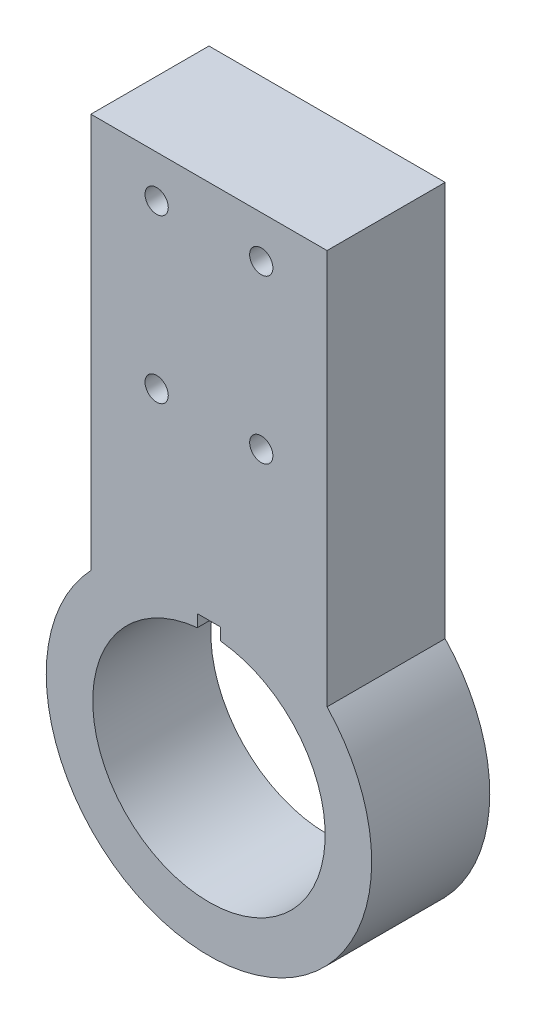
ISO-10303-21;
HEADER;
FILE_DESCRIPTION(('STEP AP214'),'2;1');
FILE_NAME('part.step','',(''),(''),'','','');
FILE_SCHEMA(('AUTOMOTIVE_DESIGN { 1 0 10303 214 1 1 1 1 }'));
ENDSEC;
DATA;
#1=APPLICATION_CONTEXT('core data for automotive mechanical design processes');
#2=APPLICATION_PROTOCOL_DEFINITION('international standard','automotive_design',2000,#1);
#3=PRODUCT_CONTEXT('',#1,'mechanical');
#4=PRODUCT('Part','Part','',(#3));
#5=PRODUCT_RELATED_PRODUCT_CATEGORY('part','',(#4));
#6=PRODUCT_DEFINITION_FORMATION('','',#4);
#7=PRODUCT_DEFINITION_CONTEXT('part definition',#1,'design');
#8=PRODUCT_DEFINITION('design','',#6,#7);
#9=PRODUCT_DEFINITION_SHAPE('','',#8);
#10=(LENGTH_UNIT() NAMED_UNIT(*) SI_UNIT(.MILLI.,.METRE.));
#11=(NAMED_UNIT(*) PLANE_ANGLE_UNIT() SI_UNIT($,.RADIAN.));
#12=(NAMED_UNIT(*) SI_UNIT($,.STERADIAN.) SOLID_ANGLE_UNIT());
#13=UNCERTAINTY_MEASURE_WITH_UNIT(LENGTH_MEASURE(1.E-05),#10,'distance_accuracy_value','');
#14=(GEOMETRIC_REPRESENTATION_CONTEXT(3) GLOBAL_UNCERTAINTY_ASSIGNED_CONTEXT((#13)) GLOBAL_UNIT_ASSIGNED_CONTEXT((#10,
#11,#12)) REPRESENTATION_CONTEXT('',''));
#15=CARTESIAN_POINT('',(0.,0.,0.));
#16=DIRECTION('',(0.,0.,1.));
#17=DIRECTION('',(1.,0.,0.));
#18=AXIS2_PLACEMENT_3D('',#15,#16,#17);
#19=CARTESIAN_POINT('',(0.,0.,25.4));
#20=DIRECTION('',(0.,0.,1.));
#21=DIRECTION('',(1.,0.,0.));
#22=AXIS2_PLACEMENT_3D('',#19,#20,#21);
#23=PLANE('',#22);
#24=CARTESIAN_POINT('',(-11.25,100.,25.4));
#25=DIRECTION('',(0.,0.,1.));
#26=DIRECTION('',(1.,0.,0.));
#27=AXIS2_PLACEMENT_3D('',#24,#25,#26);
#28=CIRCLE('',#27,2.5);
#29=CARTESIAN_POINT('',(-8.74999999999999,100.,25.4));
#30=VERTEX_POINT('',#29);
#31=EDGE_CURVE('E311',#30,#30,#28,.T.);
#32=ORIENTED_EDGE('',*,*,#31,.F.);
#33=EDGE_LOOP('',(#32));
#34=FACE_BOUND('',#33,.T.);
#35=CARTESIAN_POINT('',(11.25,65.,25.4));
#36=DIRECTION('',(0.,0.,1.));
#37=DIRECTION('',(1.,0.,0.));
#38=AXIS2_PLACEMENT_3D('',#35,#36,#37);
#39=CIRCLE('',#38,2.5);
#40=CARTESIAN_POINT('',(13.75,65.,25.4));
#41=VERTEX_POINT('',#40);
#42=EDGE_CURVE('E314',#41,#41,#39,.T.);
#43=ORIENTED_EDGE('',*,*,#42,.F.);
#44=EDGE_LOOP('',(#43));
#45=FACE_BOUND('',#44,.T.);
#46=CARTESIAN_POINT('',(-11.25,65.,25.4));
#47=DIRECTION('',(0.,0.,1.));
#48=DIRECTION('',(1.,0.,0.));
#49=AXIS2_PLACEMENT_3D('',#46,#47,#48);
#50=CIRCLE('',#49,2.5);
#51=CARTESIAN_POINT('',(-8.75000000000002,65.,25.4));
#52=VERTEX_POINT('',#51);
#53=EDGE_CURVE('E328',#52,#52,#50,.T.);
#54=ORIENTED_EDGE('',*,*,#53,.F.);
#55=EDGE_LOOP('',(#54));
#56=FACE_BOUND('',#55,.T.);
#57=CARTESIAN_POINT('',(11.25,100.,25.4));
#58=DIRECTION('',(0.,0.,1.));
#59=DIRECTION('',(1.,0.,0.));
#60=AXIS2_PLACEMENT_3D('',#57,#58,#59);
#61=CIRCLE('',#60,2.5);
#62=CARTESIAN_POINT('',(13.75,100.,25.4));
#63=VERTEX_POINT('',#62);
#64=EDGE_CURVE('E315',#63,#63,#61,.T.);
#65=ORIENTED_EDGE('',*,*,#64,.F.);
#66=EDGE_LOOP('',(#65));
#67=FACE_BOUND('',#66,.T.);
#68=DIRECTION('',(0.,-1.,0.));
#69=VECTOR('',#68,1.);
#70=CARTESIAN_POINT('',(-2.5,0.,25.4));
#71=LINE('',#70,#69);
#72=CARTESIAN_POINT('',(-2.5,27.5,25.4));
#73=VERTEX_POINT('',#72);
#74=CARTESIAN_POINT('',(-2.5,24.8746859276655,25.4));
#75=VERTEX_POINT('',#74);
#76=EDGE_CURVE('E138',#73,#75,#71,.T.);
#77=ORIENTED_EDGE('',*,*,#76,.F.);
#78=DIRECTION('',(-1.,0.,0.));
#79=VECTOR('',#78,1.);
#80=CARTESIAN_POINT('',(-2.5,27.5,25.4));
#81=LINE('',#80,#79);
#82=CARTESIAN_POINT('',(2.5,27.5,25.4));
#83=VERTEX_POINT('',#82);
#84=EDGE_CURVE('E132',#83,#73,#81,.T.);
#85=ORIENTED_EDGE('',*,*,#84,.F.);
#86=DIRECTION('',(0.,1.,0.));
#87=VECTOR('',#86,1.);
#88=CARTESIAN_POINT('',(2.5,27.5,25.4));
#89=LINE('',#88,#87);
#90=CARTESIAN_POINT('',(2.5,24.8746859276655,25.4));
#91=VERTEX_POINT('',#90);
#92=EDGE_CURVE('E114',#91,#83,#89,.T.);
#93=ORIENTED_EDGE('',*,*,#92,.F.);
#94=CARTESIAN_POINT('',(0.,0.,25.4));
#95=DIRECTION('',(0.,0.,1.));
#96=DIRECTION('',(1.,0.,0.));
#97=AXIS2_PLACEMENT_3D('',#94,#95,#96);
#98=CIRCLE('',#97,25.);
#99=EDGE_CURVE('E144',#75,#91,#98,.T.);
#100=ORIENTED_EDGE('',*,*,#99,.F.);
#101=EDGE_LOOP('',(#77,#85,#93,#100));
#102=FACE_BOUND('',#101,.T.);
#103=DIRECTION('',(0.,1.,0.));
#104=VECTOR('',#103,1.);
#105=CARTESIAN_POINT('',(25.4,24.0798671092679,25.4));
#106=LINE('',#105,#104);
#107=CARTESIAN_POINT('',(25.4,24.0798671092679,25.4));
#108=VERTEX_POINT('',#107);
#109=CARTESIAN_POINT('',(25.4,109.079867109268,25.4));
#110=VERTEX_POINT('',#109);
#111=EDGE_CURVE('E146',#108,#110,#106,.T.);
#112=ORIENTED_EDGE('',*,*,#111,.T.);
#113=DIRECTION('',(-1.,0.,0.));
#114=VECTOR('',#113,1.);
#115=CARTESIAN_POINT('',(-25.4,109.079867109268,25.4));
#116=LINE('',#115,#114);
#117=CARTESIAN_POINT('',(-25.4,109.079867109268,25.4));
#118=VERTEX_POINT('',#117);
#119=EDGE_CURVE('E95',#110,#118,#116,.T.);
#120=ORIENTED_EDGE('',*,*,#119,.T.);
#121=DIRECTION('',(0.,-1.,0.));
#122=VECTOR('',#121,1.);
#123=CARTESIAN_POINT('',(-25.4,24.0798671092679,25.4));
#124=LINE('',#123,#122);
#125=CARTESIAN_POINT('',(-25.4,24.0798671092679,25.4));
#126=VERTEX_POINT('',#125);
#127=EDGE_CURVE('E155',#118,#126,#124,.T.);
#128=ORIENTED_EDGE('',*,*,#127,.T.);
#129=CARTESIAN_POINT('',(0.,0.,25.4));
#130=DIRECTION('',(0.,0.,1.));
#131=DIRECTION('',(1.,0.,0.));
#132=AXIS2_PLACEMENT_3D('',#129,#130,#131);
#133=CIRCLE('',#132,35.);
#134=EDGE_CURVE('E64',#126,#108,#133,.T.);
#135=ORIENTED_EDGE('',*,*,#134,.T.);
#136=EDGE_LOOP('',(#112,#120,#128,#135));
#137=FACE_BOUND('',#136,.T.);
#138=ADVANCED_FACE('F39',(#34,#45,#56,#67,#102,#137),#23,.T.);
#139=CARTESIAN_POINT('',(0.,0.,0.));
#140=DIRECTION('',(0.,0.,1.));
#141=DIRECTION('',(1.,0.,0.));
#142=AXIS2_PLACEMENT_3D('',#139,#140,#141);
#143=PLANE('',#142);
#144=CARTESIAN_POINT('',(-11.25,100.,0.));
#145=DIRECTION('',(0.,0.,1.));
#146=DIRECTION('',(1.,0.,0.));
#147=AXIS2_PLACEMENT_3D('',#144,#145,#146);
#148=CIRCLE('',#147,2.5);
#149=CARTESIAN_POINT('',(-8.74999999999999,100.,0.));
#150=VERTEX_POINT('',#149);
#151=EDGE_CURVE('E307',#150,#150,#148,.T.);
#152=ORIENTED_EDGE('',*,*,#151,.T.);
#153=EDGE_LOOP('',(#152));
#154=FACE_BOUND('',#153,.T.);
#155=CARTESIAN_POINT('',(11.25,65.,0.));
#156=DIRECTION('',(0.,0.,1.));
#157=DIRECTION('',(1.,0.,0.));
#158=AXIS2_PLACEMENT_3D('',#155,#156,#157);
#159=CIRCLE('',#158,2.5);
#160=CARTESIAN_POINT('',(13.75,65.,0.));
#161=VERTEX_POINT('',#160);
#162=EDGE_CURVE('E324',#161,#161,#159,.T.);
#163=ORIENTED_EDGE('',*,*,#162,.T.);
#164=EDGE_LOOP('',(#163));
#165=FACE_BOUND('',#164,.T.);
#166=CARTESIAN_POINT('',(-11.25,65.,0.));
#167=DIRECTION('',(0.,0.,1.));
#168=DIRECTION('',(1.,0.,0.));
#169=AXIS2_PLACEMENT_3D('',#166,#167,#168);
#170=CIRCLE('',#169,2.5);
#171=CARTESIAN_POINT('',(-8.75000000000002,65.,0.));
#172=VERTEX_POINT('',#171);
#173=EDGE_CURVE('E319',#172,#172,#170,.T.);
#174=ORIENTED_EDGE('',*,*,#173,.T.);
#175=EDGE_LOOP('',(#174));
#176=FACE_BOUND('',#175,.T.);
#177=CARTESIAN_POINT('',(11.25,100.,0.));
#178=DIRECTION('',(0.,0.,1.));
#179=DIRECTION('',(1.,0.,0.));
#180=AXIS2_PLACEMENT_3D('',#177,#178,#179);
#181=CIRCLE('',#180,2.5);
#182=CARTESIAN_POINT('',(13.75,100.,0.));
#183=VERTEX_POINT('',#182);
#184=EDGE_CURVE('E136',#183,#183,#181,.T.);
#185=ORIENTED_EDGE('',*,*,#184,.T.);
#186=EDGE_LOOP('',(#185));
#187=FACE_BOUND('',#186,.T.);
#188=DIRECTION('',(0.,1.,0.));
#189=VECTOR('',#188,1.);
#190=CARTESIAN_POINT('',(25.4,24.0798671092679,0.));
#191=LINE('',#190,#189);
#192=CARTESIAN_POINT('',(25.4,24.0798671092679,0.));
#193=VERTEX_POINT('',#192);
#194=CARTESIAN_POINT('',(25.4,109.079867109268,0.));
#195=VERTEX_POINT('',#194);
#196=EDGE_CURVE('E150',#193,#195,#191,.T.);
#197=ORIENTED_EDGE('',*,*,#196,.F.);
#198=CARTESIAN_POINT('',(0.,0.,0.));
#199=DIRECTION('',(0.,0.,1.));
#200=DIRECTION('',(1.,0.,0.));
#201=AXIS2_PLACEMENT_3D('',#198,#199,#200);
#202=CIRCLE('',#201,35.);
#203=CARTESIAN_POINT('',(-25.4,24.0798671092679,0.));
#204=VERTEX_POINT('',#203);
#205=EDGE_CURVE('E81',#204,#193,#202,.T.);
#206=ORIENTED_EDGE('',*,*,#205,.F.);
#207=DIRECTION('',(0.,-1.,0.));
#208=VECTOR('',#207,1.);
#209=CARTESIAN_POINT('',(-25.4,24.0798671092679,0.));
#210=LINE('',#209,#208);
#211=CARTESIAN_POINT('',(-25.4,109.079867109268,0.));
#212=VERTEX_POINT('',#211);
#213=EDGE_CURVE('E156',#212,#204,#210,.T.);
#214=ORIENTED_EDGE('',*,*,#213,.F.);
#215=DIRECTION('',(-1.,0.,0.));
#216=VECTOR('',#215,1.);
#217=CARTESIAN_POINT('',(-25.4,109.079867109268,0.));
#218=LINE('',#217,#216);
#219=EDGE_CURVE('E158',#195,#212,#218,.T.);
#220=ORIENTED_EDGE('',*,*,#219,.F.);
#221=EDGE_LOOP('',(#197,#206,#214,#220));
#222=FACE_BOUND('',#221,.T.);
#223=DIRECTION('',(-1.,0.,0.));
#224=VECTOR('',#223,1.);
#225=CARTESIAN_POINT('',(-2.5,27.5,0.));
#226=LINE('',#225,#224);
#227=CARTESIAN_POINT('',(2.5,27.5,0.));
#228=VERTEX_POINT('',#227);
#229=CARTESIAN_POINT('',(-2.5,27.5,0.));
#230=VERTEX_POINT('',#229);
#231=EDGE_CURVE('E119',#228,#230,#226,.T.);
#232=ORIENTED_EDGE('',*,*,#231,.T.);
#233=DIRECTION('',(0.,-1.,0.));
#234=VECTOR('',#233,1.);
#235=CARTESIAN_POINT('',(-2.5,0.,0.));
#236=LINE('',#235,#234);
#237=CARTESIAN_POINT('',(-2.5,24.8746859276655,0.));
#238=VERTEX_POINT('',#237);
#239=EDGE_CURVE('E135',#230,#238,#236,.T.);
#240=ORIENTED_EDGE('',*,*,#239,.T.);
#241=CARTESIAN_POINT('',(0.,0.,0.));
#242=DIRECTION('',(0.,0.,1.));
#243=DIRECTION('',(1.,0.,0.));
#244=AXIS2_PLACEMENT_3D('',#241,#242,#243);
#245=CIRCLE('',#244,25.);
#246=CARTESIAN_POINT('',(2.5,24.8746859276655,0.));
#247=VERTEX_POINT('',#246);
#248=EDGE_CURVE('E133',#238,#247,#245,.T.);
#249=ORIENTED_EDGE('',*,*,#248,.T.);
#250=DIRECTION('',(0.,1.,0.));
#251=VECTOR('',#250,1.);
#252=CARTESIAN_POINT('',(2.5,27.5,0.));
#253=LINE('',#252,#251);
#254=EDGE_CURVE('E53',#247,#228,#253,.T.);
#255=ORIENTED_EDGE('',*,*,#254,.T.);
#256=EDGE_LOOP('',(#232,#240,#249,#255));
#257=FACE_BOUND('',#256,.T.);
#258=ADVANCED_FACE('F126',(#154,#165,#176,#187,#222,#257),#143,.F.);
#259=CARTESIAN_POINT('',(25.4,24.0798671092679,25.4));
#260=DIRECTION('',(-1.,0.,0.));
#261=DIRECTION('',(0.,0.,1.));
#262=AXIS2_PLACEMENT_3D('',#259,#260,#261);
#263=PLANE('',#262);
#264=ORIENTED_EDGE('',*,*,#196,.T.);
#265=DIRECTION('',(0.,0.,-1.));
#266=VECTOR('',#265,1.);
#267=CARTESIAN_POINT('',(25.4,109.079867109268,25.4));
#268=LINE('',#267,#266);
#269=EDGE_CURVE('E169',#110,#195,#268,.T.);
#270=ORIENTED_EDGE('',*,*,#269,.F.);
#271=ORIENTED_EDGE('',*,*,#111,.F.);
#272=DIRECTION('',(0.,0.,-1.));
#273=VECTOR('',#272,1.);
#274=CARTESIAN_POINT('',(25.4,24.0798671092679,25.4));
#275=LINE('',#274,#273);
#276=EDGE_CURVE('E154',#108,#193,#275,.T.);
#277=ORIENTED_EDGE('',*,*,#276,.T.);
#278=EDGE_LOOP('',(#264,#270,#271,#277));
#279=FACE_BOUND('',#278,.T.);
#280=ADVANCED_FACE('F41',(#279),#263,.F.);
#281=CARTESIAN_POINT('',(-25.4,109.079867109268,25.4));
#282=DIRECTION('',(0.,-1.,0.));
#283=DIRECTION('',(0.,0.,-1.));
#284=AXIS2_PLACEMENT_3D('',#281,#282,#283);
#285=PLANE('',#284);
#286=ORIENTED_EDGE('',*,*,#219,.T.);
#287=DIRECTION('',(0.,0.,-1.));
#288=VECTOR('',#287,1.);
#289=CARTESIAN_POINT('',(-25.4,109.079867109268,25.4));
#290=LINE('',#289,#288);
#291=EDGE_CURVE('E168',#118,#212,#290,.T.);
#292=ORIENTED_EDGE('',*,*,#291,.F.);
#293=ORIENTED_EDGE('',*,*,#119,.F.);
#294=ORIENTED_EDGE('',*,*,#269,.T.);
#295=EDGE_LOOP('',(#286,#292,#293,#294));
#296=FACE_BOUND('',#295,.T.);
#297=ADVANCED_FACE('F204',(#296),#285,.F.);
#298=CARTESIAN_POINT('',(-25.4,24.0798671092679,25.4));
#299=DIRECTION('',(1.,0.,0.));
#300=DIRECTION('',(0.,0.,-1.));
#301=AXIS2_PLACEMENT_3D('',#298,#299,#300);
#302=PLANE('',#301);
#303=ORIENTED_EDGE('',*,*,#213,.T.);
#304=DIRECTION('',(0.,0.,-1.));
#305=VECTOR('',#304,1.);
#306=CARTESIAN_POINT('',(-25.4,24.0798671092679,25.4));
#307=LINE('',#306,#305);
#308=EDGE_CURVE('E165',#126,#204,#307,.T.);
#309=ORIENTED_EDGE('',*,*,#308,.F.);
#310=ORIENTED_EDGE('',*,*,#127,.F.);
#311=ORIENTED_EDGE('',*,*,#291,.T.);
#312=EDGE_LOOP('',(#303,#309,#310,#311));
#313=FACE_BOUND('',#312,.T.);
#314=ADVANCED_FACE('F205',(#313),#302,.F.);
#315=CARTESIAN_POINT('',(0.,0.,25.4));
#316=DIRECTION('',(0.,0.,-1.));
#317=DIRECTION('',(-1.,0.,0.));
#318=AXIS2_PLACEMENT_3D('',#315,#316,#317);
#319=CYLINDRICAL_SURFACE('',#318,35.);
#320=ORIENTED_EDGE('',*,*,#205,.T.);
#321=ORIENTED_EDGE('',*,*,#276,.F.);
#322=ORIENTED_EDGE('',*,*,#134,.F.);
#323=ORIENTED_EDGE('',*,*,#308,.T.);
#324=EDGE_LOOP('',(#320,#321,#322,#323));
#325=FACE_BOUND('',#324,.T.);
#326=ADVANCED_FACE('F184',(#325),#319,.T.);
#327=CARTESIAN_POINT('',(0.,0.,25.4));
#328=DIRECTION('',(0.,0.,-1.));
#329=DIRECTION('',(-1.,0.,0.));
#330=AXIS2_PLACEMENT_3D('',#327,#328,#329);
#331=CYLINDRICAL_SURFACE('',#330,25.);
#332=DIRECTION('',(0.,0.,-1.));
#333=VECTOR('',#332,1.);
#334=CARTESIAN_POINT('',(-2.5,24.8746859276655,25.4));
#335=LINE('',#334,#333);
#336=EDGE_CURVE('E11',#75,#238,#335,.T.);
#337=ORIENTED_EDGE('',*,*,#336,.F.);
#338=ORIENTED_EDGE('',*,*,#99,.T.);
#339=DIRECTION('',(0.,0.,-1.));
#340=VECTOR('',#339,1.);
#341=CARTESIAN_POINT('',(2.5,24.8746859276655,25.4));
#342=LINE('',#341,#340);
#343=EDGE_CURVE('E50',#247,#91,#342,.F.);
#344=ORIENTED_EDGE('',*,*,#343,.F.);
#345=ORIENTED_EDGE('',*,*,#248,.F.);
#346=EDGE_LOOP('',(#337,#338,#344,#345));
#347=FACE_BOUND('',#346,.T.);
#348=ADVANCED_FACE('F174',(#347),#331,.F.);
#349=CARTESIAN_POINT('',(-2.5,0.,0.));
#350=DIRECTION('',(-1.,0.,0.));
#351=DIRECTION('',(0.,-1.,0.));
#352=AXIS2_PLACEMENT_3D('',#349,#350,#351);
#353=PLANE('',#352);
#354=ORIENTED_EDGE('',*,*,#336,.T.);
#355=ORIENTED_EDGE('',*,*,#239,.F.);
#356=DIRECTION('',(0.,0.,1.));
#357=VECTOR('',#356,1.);
#358=CARTESIAN_POINT('',(-2.5,27.5,0.));
#359=LINE('',#358,#357);
#360=EDGE_CURVE('E118',#230,#73,#359,.T.);
#361=ORIENTED_EDGE('',*,*,#360,.T.);
#362=ORIENTED_EDGE('',*,*,#76,.T.);
#363=EDGE_LOOP('',(#354,#355,#361,#362));
#364=FACE_BOUND('',#363,.T.);
#365=ADVANCED_FACE('F180',(#364),#353,.F.);
#366=CARTESIAN_POINT('',(-2.5,27.5,0.));
#367=DIRECTION('',(0.,1.,0.));
#368=DIRECTION('',(0.,0.,1.));
#369=AXIS2_PLACEMENT_3D('',#366,#367,#368);
#370=PLANE('',#369);
#371=ORIENTED_EDGE('',*,*,#84,.T.);
#372=ORIENTED_EDGE('',*,*,#360,.F.);
#373=ORIENTED_EDGE('',*,*,#231,.F.);
#374=DIRECTION('',(0.,0.,1.));
#375=VECTOR('',#374,1.);
#376=CARTESIAN_POINT('',(2.5,27.5,0.));
#377=LINE('',#376,#375);
#378=EDGE_CURVE('E111',#228,#83,#377,.T.);
#379=ORIENTED_EDGE('',*,*,#378,.T.);
#380=EDGE_LOOP('',(#371,#372,#373,#379));
#381=FACE_BOUND('',#380,.T.);
#382=ADVANCED_FACE('F124',(#381),#370,.F.);
#383=CARTESIAN_POINT('',(2.5,27.5,0.));
#384=DIRECTION('',(1.,0.,0.));
#385=DIRECTION('',(0.,1.,0.));
#386=AXIS2_PLACEMENT_3D('',#383,#384,#385);
#387=PLANE('',#386);
#388=ORIENTED_EDGE('',*,*,#343,.T.);
#389=ORIENTED_EDGE('',*,*,#92,.T.);
#390=ORIENTED_EDGE('',*,*,#378,.F.);
#391=ORIENTED_EDGE('',*,*,#254,.F.);
#392=EDGE_LOOP('',(#388,#389,#390,#391));
#393=FACE_BOUND('',#392,.T.);
#394=ADVANCED_FACE('F113',(#393),#387,.F.);
#395=CARTESIAN_POINT('',(11.25,100.,0.));
#396=DIRECTION('',(0.,0.,1.));
#397=DIRECTION('',(1.,0.,0.));
#398=AXIS2_PLACEMENT_3D('',#395,#396,#397);
#399=CYLINDRICAL_SURFACE('',#398,2.5);
#400=ORIENTED_EDGE('',*,*,#184,.F.);
#401=EDGE_LOOP('',(#400));
#402=FACE_BOUND('',#401,.T.);
#403=ORIENTED_EDGE('',*,*,#64,.T.);
#404=EDGE_LOOP('',(#403));
#405=FACE_BOUND('',#404,.T.);
#406=ADVANCED_FACE('F264',(#402,#405),#399,.F.);
#407=CARTESIAN_POINT('',(-11.25,65.,0.));
#408=DIRECTION('',(0.,0.,1.));
#409=DIRECTION('',(1.,0.,0.));
#410=AXIS2_PLACEMENT_3D('',#407,#408,#409);
#411=CYLINDRICAL_SURFACE('',#410,2.5);
#412=ORIENTED_EDGE('',*,*,#173,.F.);
#413=EDGE_LOOP('',(#412));
#414=FACE_BOUND('',#413,.T.);
#415=ORIENTED_EDGE('',*,*,#53,.T.);
#416=EDGE_LOOP('',(#415));
#417=FACE_BOUND('',#416,.T.);
#418=ADVANCED_FACE('F271',(#414,#417),#411,.F.);
#419=CARTESIAN_POINT('',(11.25,65.,0.));
#420=DIRECTION('',(0.,0.,1.));
#421=DIRECTION('',(1.,0.,0.));
#422=AXIS2_PLACEMENT_3D('',#419,#420,#421);
#423=CYLINDRICAL_SURFACE('',#422,2.5);
#424=ORIENTED_EDGE('',*,*,#162,.F.);
#425=EDGE_LOOP('',(#424));
#426=FACE_BOUND('',#425,.T.);
#427=ORIENTED_EDGE('',*,*,#42,.T.);
#428=EDGE_LOOP('',(#427));
#429=FACE_BOUND('',#428,.T.);
#430=ADVANCED_FACE('F281',(#426,#429),#423,.F.);
#431=CARTESIAN_POINT('',(-11.25,100.,0.));
#432=DIRECTION('',(0.,0.,1.));
#433=DIRECTION('',(1.,0.,0.));
#434=AXIS2_PLACEMENT_3D('',#431,#432,#433);
#435=CYLINDRICAL_SURFACE('',#434,2.5);
#436=ORIENTED_EDGE('',*,*,#151,.F.);
#437=EDGE_LOOP('',(#436));
#438=FACE_BOUND('',#437,.T.);
#439=ORIENTED_EDGE('',*,*,#31,.T.);
#440=EDGE_LOOP('',(#439));
#441=FACE_BOUND('',#440,.T.);
#442=ADVANCED_FACE('F291',(#438,#441),#435,.F.);
#443=CLOSED_SHELL('',(#138,#258,#280,#297,#314,#326,#348,#365,#382,#394,#406,#418,#430,#442));
#444=MANIFOLD_SOLID_BREP('B2',#443);
#445=ADVANCED_BREP_SHAPE_REPRESENTATION('',(#18,#444),#14);
#446=SHAPE_DEFINITION_REPRESENTATION(#9,#445);
ENDSEC;
END-ISO-10303-21;
